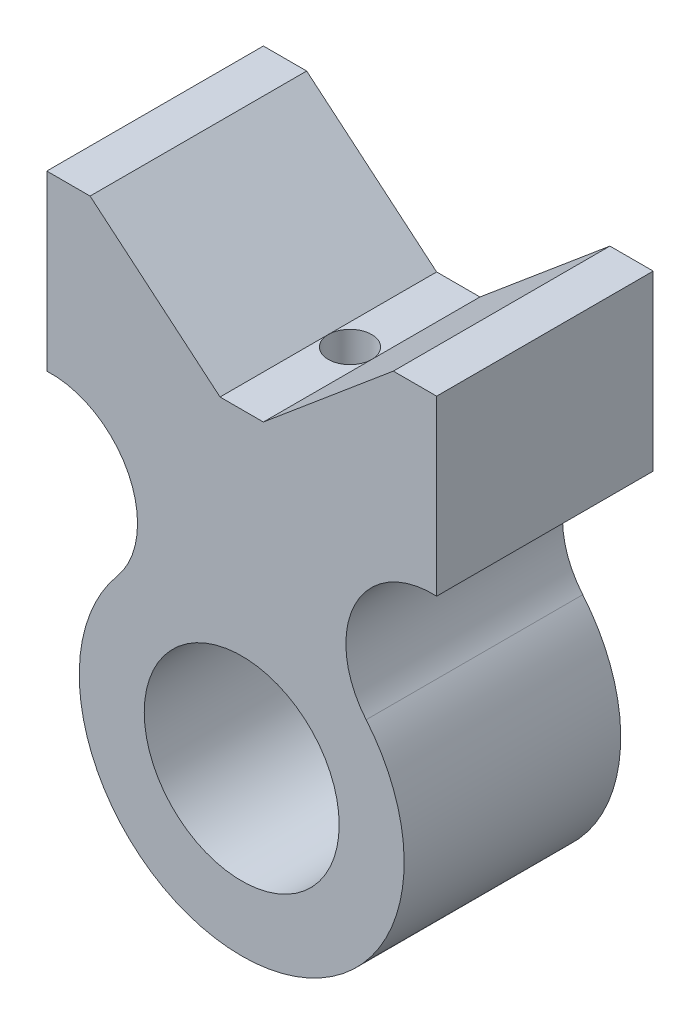
ISO-10303-21;
HEADER;
FILE_DESCRIPTION(('STEP AP214'),'2;1');
FILE_NAME('part.step','',(''),(''),'','','');
FILE_SCHEMA(('AUTOMOTIVE_DESIGN { 1 0 10303 214 1 1 1 1 }'));
ENDSEC;
DATA;
#1=APPLICATION_CONTEXT('core data for automotive mechanical design processes');
#2=APPLICATION_PROTOCOL_DEFINITION('international standard','automotive_design',2000,#1);
#3=PRODUCT_CONTEXT('',#1,'mechanical');
#4=PRODUCT('Part','Part','',(#3));
#5=PRODUCT_RELATED_PRODUCT_CATEGORY('part','',(#4));
#6=PRODUCT_DEFINITION_FORMATION('','',#4);
#7=PRODUCT_DEFINITION_CONTEXT('part definition',#1,'design');
#8=PRODUCT_DEFINITION('design','',#6,#7);
#9=PRODUCT_DEFINITION_SHAPE('','',#8);
#10=(LENGTH_UNIT() NAMED_UNIT(*) SI_UNIT(.MILLI.,.METRE.));
#11=(NAMED_UNIT(*) PLANE_ANGLE_UNIT() SI_UNIT($,.RADIAN.));
#12=(NAMED_UNIT(*) SI_UNIT($,.STERADIAN.) SOLID_ANGLE_UNIT());
#13=UNCERTAINTY_MEASURE_WITH_UNIT(LENGTH_MEASURE(1.E-05),#10,'distance_accuracy_value','');
#14=(GEOMETRIC_REPRESENTATION_CONTEXT(3) GLOBAL_UNCERTAINTY_ASSIGNED_CONTEXT((#13)) GLOBAL_UNIT_ASSIGNED_CONTEXT((#10,
#11,#12)) REPRESENTATION_CONTEXT('',''));
#15=CARTESIAN_POINT('',(0.,0.,0.));
#16=DIRECTION('',(0.,0.,1.));
#17=DIRECTION('',(1.,0.,0.));
#18=AXIS2_PLACEMENT_3D('',#15,#16,#17);
#19=CARTESIAN_POINT('',(5.,71.7646069847752,50.));
#20=DIRECTION('',(0.,-1.,0.));
#21=DIRECTION('',(1.,0.,0.));
#22=AXIS2_PLACEMENT_3D('',#19,#20,#21);
#23=PLANE('',#22);
#24=DIRECTION('',(0.,0.,-1.));
#25=VECTOR('',#24,1.);
#26=CARTESIAN_POINT('',(5.,71.7646069847752,50.));
#27=LINE('',#26,#25);
#28=CARTESIAN_POINT('',(5.,71.7646069847752,50.));
#29=VERTEX_POINT('',#28);
#30=CARTESIAN_POINT('',(5.,71.7646069847752,25.));
#31=VERTEX_POINT('',#30);
#32=EDGE_CURVE('E186',#29,#31,#27,.T.);
#33=ORIENTED_EDGE('',*,*,#32,.T.);
#34=CARTESIAN_POINT('',(4.97966993922955E-13,71.7646069847752,25.));
#35=DIRECTION('',(0.,1.,0.));
#36=DIRECTION('',(-1.,0.,0.));
#37=AXIS2_PLACEMENT_3D('',#34,#35,#36);
#38=CIRCLE('',#37,5.0000000000005);
#39=CARTESIAN_POINT('',(-5.,71.7646069847753,25.));
#40=VERTEX_POINT('',#39);
#41=EDGE_CURVE('E47',#40,#31,#38,.T.);
#42=ORIENTED_EDGE('',*,*,#41,.F.);
#43=DIRECTION('',(0.,0.,-1.));
#44=VECTOR('',#43,1.);
#45=CARTESIAN_POINT('',(-5.,71.7646069847753,50.));
#46=LINE('',#45,#44);
#47=CARTESIAN_POINT('',(-5.,71.7646069847753,50.));
#48=VERTEX_POINT('',#47);
#49=EDGE_CURVE('E182',#48,#40,#46,.T.);
#50=ORIENTED_EDGE('',*,*,#49,.F.);
#51=DIRECTION('',(-1.,0.,0.));
#52=VECTOR('',#51,1.);
#53=CARTESIAN_POINT('',(5.,71.7646069847752,50.));
#54=LINE('',#53,#52);
#55=EDGE_CURVE('E212',#29,#48,#54,.T.);
#56=ORIENTED_EDGE('',*,*,#55,.F.);
#57=EDGE_LOOP('',(#33,#42,#50,#56));
#58=FACE_BOUND('',#57,.T.);
#59=ADVANCED_FACE('F33',(#58),#23,.F.);
#60=CARTESIAN_POINT('',(44.0475554793416,36.9602875569761,50.));
#61=DIRECTION('',(0.,0.,-1.));
#62=DIRECTION('',(-1.,0.,0.));
#63=AXIS2_PLACEMENT_3D('',#60,#61,#62);
#64=PLANE('',#63);
#65=CARTESIAN_POINT('',(44.0475554793416,36.9602875569761,50.));
#66=DIRECTION('',(0.,0.,-1.));
#67=DIRECTION('',(-1.,0.,0.));
#68=AXIS2_PLACEMENT_3D('',#65,#66,#67);
#69=CIRCLE('',#68,20.0000000000003);
#70=CARTESIAN_POINT('',(28.7266666169617,24.1045353632452,50.));
#71=VERTEX_POINT('',#70);
#72=CARTESIAN_POINT('',(45.,56.9375959200936,50.));
#73=VERTEX_POINT('',#72);
#74=EDGE_CURVE('E174',#71,#73,#69,.T.);
#75=ORIENTED_EDGE('',*,*,#74,.T.);
#76=DIRECTION('',(0.,1.,0.));
#77=VECTOR('',#76,1.);
#78=CARTESIAN_POINT('',(45.,56.9375959200936,50.));
#79=LINE('',#78,#77);
#80=CARTESIAN_POINT('',(45.,96.9375959200936,50.));
#81=VERTEX_POINT('',#80);
#82=EDGE_CURVE('E103',#73,#81,#79,.T.);
#83=ORIENTED_EDGE('',*,*,#82,.T.);
#84=DIRECTION('',(-1.,0.,0.));
#85=VECTOR('',#84,1.);
#86=CARTESIAN_POINT('',(35.,96.9375959200936,50.));
#87=LINE('',#86,#85);
#88=CARTESIAN_POINT('',(35.,96.9375959200936,50.));
#89=VERTEX_POINT('',#88);
#90=EDGE_CURVE('E197',#81,#89,#87,.T.);
#91=ORIENTED_EDGE('',*,*,#90,.T.);
#92=DIRECTION('',(-0.766044443118978,-0.642787609686539,0.));
#93=VECTOR('',#92,1.);
#94=CARTESIAN_POINT('',(35.,96.9375959200936,50.));
#95=LINE('',#94,#93);
#96=EDGE_CURVE('E210',#89,#29,#95,.T.);
#97=ORIENTED_EDGE('',*,*,#96,.T.);
#98=ORIENTED_EDGE('',*,*,#55,.T.);
#99=DIRECTION('',(-0.766044443118979,0.642787609686538,0.));
#100=VECTOR('',#99,1.);
#101=CARTESIAN_POINT('',(-35.,96.9375959200936,50.));
#102=LINE('',#101,#100);
#103=CARTESIAN_POINT('',(-35.,96.9375959200936,50.));
#104=VERTEX_POINT('',#103);
#105=EDGE_CURVE('E214',#48,#104,#102,.T.);
#106=ORIENTED_EDGE('',*,*,#105,.T.);
#107=DIRECTION('',(-1.,0.,0.));
#108=VECTOR('',#107,1.);
#109=CARTESIAN_POINT('',(-35.,96.9375959200936,50.));
#110=LINE('',#109,#108);
#111=CARTESIAN_POINT('',(-45.,96.9375959200936,50.));
#112=VERTEX_POINT('',#111);
#113=EDGE_CURVE('E131',#104,#112,#110,.T.);
#114=ORIENTED_EDGE('',*,*,#113,.T.);
#115=DIRECTION('',(0.,-1.,0.));
#116=VECTOR('',#115,1.);
#117=CARTESIAN_POINT('',(-45.,56.9375959200936,50.));
#118=LINE('',#117,#116);
#119=CARTESIAN_POINT('',(-45.,56.9375959200936,50.));
#120=VERTEX_POINT('',#119);
#121=EDGE_CURVE('E123',#112,#120,#118,.T.);
#122=ORIENTED_EDGE('',*,*,#121,.T.);
#123=CARTESIAN_POINT('',(-44.0475554793416,36.9602875569761,50.));
#124=DIRECTION('',(0.,0.,-1.));
#125=DIRECTION('',(1.,0.,0.));
#126=AXIS2_PLACEMENT_3D('',#123,#124,#125);
#127=CIRCLE('',#126,20.0000000000003);
#128=CARTESIAN_POINT('',(-28.7266666169617,24.1045353632452,50.));
#129=VERTEX_POINT('',#128);
#130=EDGE_CURVE('E128',#120,#129,#127,.T.);
#131=ORIENTED_EDGE('',*,*,#130,.T.);
#132=CARTESIAN_POINT('',(0.,0.,50.));
#133=DIRECTION('',(0.,0.,1.));
#134=DIRECTION('',(1.,0.,0.));
#135=AXIS2_PLACEMENT_3D('',#132,#133,#134);
#136=CIRCLE('',#135,37.5);
#137=EDGE_CURVE('E56',#129,#71,#136,.T.);
#138=ORIENTED_EDGE('',*,*,#137,.T.);
#139=EDGE_LOOP('',(#75,#83,#91,#97,#98,#106,#114,#122,#131,#138));
#140=FACE_BOUND('',#139,.T.);
#141=CARTESIAN_POINT('',(0.,0.,50.));
#142=DIRECTION('',(0.,0.,1.));
#143=DIRECTION('',(1.,0.,0.));
#144=AXIS2_PLACEMENT_3D('',#141,#142,#143);
#145=CIRCLE('',#144,22.5);
#146=CARTESIAN_POINT('',(22.5,0.,50.));
#147=VERTEX_POINT('',#146);
#148=EDGE_CURVE('E156',#147,#147,#145,.T.);
#149=ORIENTED_EDGE('',*,*,#148,.F.);
#150=EDGE_LOOP('',(#149));
#151=FACE_BOUND('',#150,.T.);
#152=ADVANCED_FACE('F125',(#140,#151),#64,.F.);
#153=CARTESIAN_POINT('',(44.0475554793416,36.9602875569761,0.));
#154=DIRECTION('',(0.,0.,-1.));
#155=DIRECTION('',(-1.,0.,0.));
#156=AXIS2_PLACEMENT_3D('',#153,#154,#155);
#157=PLANE('',#156);
#158=CARTESIAN_POINT('',(44.0475554793416,36.9602875569761,0.));
#159=DIRECTION('',(0.,0.,-1.));
#160=DIRECTION('',(-1.,0.,0.));
#161=AXIS2_PLACEMENT_3D('',#158,#159,#160);
#162=CIRCLE('',#161,20.0000000000003);
#163=CARTESIAN_POINT('',(28.7266666169617,24.1045353632452,0.));
#164=VERTEX_POINT('',#163);
#165=CARTESIAN_POINT('',(45.,56.9375959200936,0.));
#166=VERTEX_POINT('',#165);
#167=EDGE_CURVE('E152',#164,#166,#162,.T.);
#168=ORIENTED_EDGE('',*,*,#167,.F.);
#169=CARTESIAN_POINT('',(0.,0.,0.));
#170=DIRECTION('',(0.,0.,1.));
#171=DIRECTION('',(1.,0.,0.));
#172=AXIS2_PLACEMENT_3D('',#169,#170,#171);
#173=CIRCLE('',#172,37.5);
#174=CARTESIAN_POINT('',(-28.7266666169617,24.1045353632452,0.));
#175=VERTEX_POINT('',#174);
#176=EDGE_CURVE('E95',#175,#164,#173,.T.);
#177=ORIENTED_EDGE('',*,*,#176,.F.);
#178=CARTESIAN_POINT('',(-44.0475554793416,36.9602875569761,0.));
#179=DIRECTION('',(0.,0.,-1.));
#180=DIRECTION('',(1.,0.,0.));
#181=AXIS2_PLACEMENT_3D('',#178,#179,#180);
#182=CIRCLE('',#181,20.0000000000003);
#183=CARTESIAN_POINT('',(-45.,56.9375959200936,0.));
#184=VERTEX_POINT('',#183);
#185=EDGE_CURVE('E171',#184,#175,#182,.T.);
#186=ORIENTED_EDGE('',*,*,#185,.F.);
#187=DIRECTION('',(0.,-1.,0.));
#188=VECTOR('',#187,1.);
#189=CARTESIAN_POINT('',(-45.,56.9375959200936,0.));
#190=LINE('',#189,#188);
#191=CARTESIAN_POINT('',(-45.,96.9375959200936,0.));
#192=VERTEX_POINT('',#191);
#193=EDGE_CURVE('E140',#192,#184,#190,.T.);
#194=ORIENTED_EDGE('',*,*,#193,.F.);
#195=DIRECTION('',(-1.,0.,0.));
#196=VECTOR('',#195,1.);
#197=CARTESIAN_POINT('',(-35.,96.9375959200936,0.));
#198=LINE('',#197,#196);
#199=CARTESIAN_POINT('',(-35.,96.9375959200936,0.));
#200=VERTEX_POINT('',#199);
#201=EDGE_CURVE('E168',#200,#192,#198,.T.);
#202=ORIENTED_EDGE('',*,*,#201,.F.);
#203=DIRECTION('',(-0.766044443118979,0.642787609686538,0.));
#204=VECTOR('',#203,1.);
#205=CARTESIAN_POINT('',(-35.,96.9375959200936,0.));
#206=LINE('',#205,#204);
#207=CARTESIAN_POINT('',(-5.,71.7646069847753,0.));
#208=VERTEX_POINT('',#207);
#209=EDGE_CURVE('E166',#208,#200,#206,.T.);
#210=ORIENTED_EDGE('',*,*,#209,.F.);
#211=DIRECTION('',(-1.,0.,0.));
#212=VECTOR('',#211,1.);
#213=CARTESIAN_POINT('',(5.,71.7646069847752,0.));
#214=LINE('',#213,#212);
#215=CARTESIAN_POINT('',(5.,71.7646069847752,0.));
#216=VERTEX_POINT('',#215);
#217=EDGE_CURVE('E163',#216,#208,#214,.T.);
#218=ORIENTED_EDGE('',*,*,#217,.F.);
#219=DIRECTION('',(-0.766044443118978,-0.642787609686539,0.));
#220=VECTOR('',#219,1.);
#221=CARTESIAN_POINT('',(35.,96.9375959200936,0.));
#222=LINE('',#221,#220);
#223=CARTESIAN_POINT('',(35.,96.9375959200936,0.));
#224=VERTEX_POINT('',#223);
#225=EDGE_CURVE('E160',#224,#216,#222,.T.);
#226=ORIENTED_EDGE('',*,*,#225,.F.);
#227=DIRECTION('',(-1.,0.,0.));
#228=VECTOR('',#227,1.);
#229=CARTESIAN_POINT('',(35.,96.9375959200936,0.));
#230=LINE('',#229,#228);
#231=CARTESIAN_POINT('',(45.,96.9375959200936,0.));
#232=VERTEX_POINT('',#231);
#233=EDGE_CURVE('E158',#232,#224,#230,.T.);
#234=ORIENTED_EDGE('',*,*,#233,.F.);
#235=DIRECTION('',(0.,1.,0.));
#236=VECTOR('',#235,1.);
#237=CARTESIAN_POINT('',(45.,56.9375959200936,0.));
#238=LINE('',#237,#236);
#239=EDGE_CURVE('E155',#166,#232,#238,.T.);
#240=ORIENTED_EDGE('',*,*,#239,.F.);
#241=EDGE_LOOP('',(#168,#177,#186,#194,#202,#210,#218,#226,#234,#240));
#242=FACE_BOUND('',#241,.T.);
#243=CARTESIAN_POINT('',(0.,0.,0.));
#244=DIRECTION('',(0.,0.,1.));
#245=DIRECTION('',(1.,0.,0.));
#246=AXIS2_PLACEMENT_3D('',#243,#244,#245);
#247=CIRCLE('',#246,22.5);
#248=CARTESIAN_POINT('',(22.5,0.,0.));
#249=VERTEX_POINT('',#248);
#250=EDGE_CURVE('E233',#249,#249,#247,.T.);
#251=ORIENTED_EDGE('',*,*,#250,.T.);
#252=EDGE_LOOP('',(#251));
#253=FACE_BOUND('',#252,.T.);
#254=ADVANCED_FACE('F201',(#242,#253),#157,.T.);
#255=CARTESIAN_POINT('',(44.0475554793416,36.9602875569761,50.));
#256=DIRECTION('',(0.,0.,-1.));
#257=DIRECTION('',(-1.,0.,0.));
#258=AXIS2_PLACEMENT_3D('',#255,#256,#257);
#259=CYLINDRICAL_SURFACE('',#258,20.0000000000003);
#260=ORIENTED_EDGE('',*,*,#167,.T.);
#261=DIRECTION('',(0.,0.,-1.));
#262=VECTOR('',#261,1.);
#263=CARTESIAN_POINT('',(45.,56.9375959200936,50.));
#264=LINE('',#263,#262);
#265=EDGE_CURVE('E11',#73,#166,#264,.T.);
#266=ORIENTED_EDGE('',*,*,#265,.F.);
#267=ORIENTED_EDGE('',*,*,#74,.F.);
#268=DIRECTION('',(0.,0.,-1.));
#269=VECTOR('',#268,1.);
#270=CARTESIAN_POINT('',(28.7266666169617,24.1045353632452,50.));
#271=LINE('',#270,#269);
#272=EDGE_CURVE('E148',#71,#164,#271,.T.);
#273=ORIENTED_EDGE('',*,*,#272,.T.);
#274=EDGE_LOOP('',(#260,#266,#267,#273));
#275=FACE_BOUND('',#274,.T.);
#276=ADVANCED_FACE('F35',(#275),#259,.F.);
#277=CARTESIAN_POINT('',(45.,56.9375959200936,50.));
#278=DIRECTION('',(-1.,0.,0.));
#279=DIRECTION('',(0.,0.,1.));
#280=AXIS2_PLACEMENT_3D('',#277,#278,#279);
#281=PLANE('',#280);
#282=ORIENTED_EDGE('',*,*,#239,.T.);
#283=DIRECTION('',(0.,0.,-1.));
#284=VECTOR('',#283,1.);
#285=CARTESIAN_POINT('',(45.,96.9375959200936,50.));
#286=LINE('',#285,#284);
#287=EDGE_CURVE('E41',#81,#232,#286,.T.);
#288=ORIENTED_EDGE('',*,*,#287,.F.);
#289=ORIENTED_EDGE('',*,*,#82,.F.);
#290=ORIENTED_EDGE('',*,*,#265,.T.);
#291=EDGE_LOOP('',(#282,#288,#289,#290));
#292=FACE_BOUND('',#291,.T.);
#293=ADVANCED_FACE('F278',(#292),#281,.F.);
#294=CARTESIAN_POINT('',(35.,96.9375959200936,50.));
#295=DIRECTION('',(0.,-1.,0.));
#296=DIRECTION('',(0.,0.,-1.));
#297=AXIS2_PLACEMENT_3D('',#294,#295,#296);
#298=PLANE('',#297);
#299=ORIENTED_EDGE('',*,*,#233,.T.);
#300=DIRECTION('',(0.,0.,-1.));
#301=VECTOR('',#300,1.);
#302=CARTESIAN_POINT('',(35.,96.9375959200936,50.));
#303=LINE('',#302,#301);
#304=EDGE_CURVE('E189',#89,#224,#303,.T.);
#305=ORIENTED_EDGE('',*,*,#304,.F.);
#306=ORIENTED_EDGE('',*,*,#90,.F.);
#307=ORIENTED_EDGE('',*,*,#287,.T.);
#308=EDGE_LOOP('',(#299,#305,#306,#307));
#309=FACE_BOUND('',#308,.T.);
#310=ADVANCED_FACE('F195',(#309),#298,.F.);
#311=CARTESIAN_POINT('',(35.,96.9375959200936,50.));
#312=DIRECTION('',(0.642787609686539,-0.766044443118978,0.));
#313=DIRECTION('',(0.766044443118979,0.642787609686539,0.));
#314=AXIS2_PLACEMENT_3D('',#311,#312,#313);
#315=PLANE('',#314);
#316=ORIENTED_EDGE('',*,*,#225,.T.);
#317=EDGE_CURVE('E185',#31,#216,#27,.T.);
#318=ORIENTED_EDGE('',*,*,#317,.F.);
#319=ORIENTED_EDGE('',*,*,#32,.F.);
#320=ORIENTED_EDGE('',*,*,#96,.F.);
#321=ORIENTED_EDGE('',*,*,#304,.T.);
#322=EDGE_LOOP('',(#316,#318,#319,#320,#321));
#323=FACE_BOUND('',#322,.T.);
#324=ADVANCED_FACE('F207',(#323),#315,.F.);
#325=EDGE_CURVE('E181',#40,#208,#46,.T.);
#326=ORIENTED_EDGE('',*,*,#325,.F.);
#327=EDGE_CURVE('E246',#31,#40,#38,.T.);
#328=ORIENTED_EDGE('',*,*,#327,.F.);
#329=ORIENTED_EDGE('',*,*,#317,.T.);
#330=ORIENTED_EDGE('',*,*,#217,.T.);
#331=EDGE_LOOP('',(#326,#328,#329,#330));
#332=FACE_BOUND('',#331,.T.);
#333=ADVANCED_FACE('F271',(#332),#23,.F.);
#334=CARTESIAN_POINT('',(-35.,96.9375959200936,50.));
#335=DIRECTION('',(-0.642787609686538,-0.766044443118979,0.));
#336=DIRECTION('',(0.766044443118979,-0.642787609686538,0.));
#337=AXIS2_PLACEMENT_3D('',#334,#335,#336);
#338=PLANE('',#337);
#339=ORIENTED_EDGE('',*,*,#209,.T.);
#340=DIRECTION('',(0.,0.,-1.));
#341=VECTOR('',#340,1.);
#342=CARTESIAN_POINT('',(-35.,96.9375959200936,50.));
#343=LINE('',#342,#341);
#344=EDGE_CURVE('E178',#104,#200,#343,.T.);
#345=ORIENTED_EDGE('',*,*,#344,.F.);
#346=ORIENTED_EDGE('',*,*,#105,.F.);
#347=ORIENTED_EDGE('',*,*,#49,.T.);
#348=ORIENTED_EDGE('',*,*,#325,.T.);
#349=EDGE_LOOP('',(#339,#345,#346,#347,#348));
#350=FACE_BOUND('',#349,.T.);
#351=ADVANCED_FACE('F223',(#350),#338,.F.);
#352=CARTESIAN_POINT('',(-35.,96.9375959200936,50.));
#353=DIRECTION('',(0.,-1.,0.));
#354=DIRECTION('',(0.,0.,-1.));
#355=AXIS2_PLACEMENT_3D('',#352,#353,#354);
#356=PLANE('',#355);
#357=ORIENTED_EDGE('',*,*,#201,.T.);
#358=DIRECTION('',(0.,0.,-1.));
#359=VECTOR('',#358,1.);
#360=CARTESIAN_POINT('',(-45.,96.9375959200936,50.));
#361=LINE('',#360,#359);
#362=EDGE_CURVE('E143',#112,#192,#361,.T.);
#363=ORIENTED_EDGE('',*,*,#362,.F.);
#364=ORIENTED_EDGE('',*,*,#113,.F.);
#365=ORIENTED_EDGE('',*,*,#344,.T.);
#366=EDGE_LOOP('',(#357,#363,#364,#365));
#367=FACE_BOUND('',#366,.T.);
#368=ADVANCED_FACE('F226',(#367),#356,.F.);
#369=CARTESIAN_POINT('',(-45.,56.9375959200936,50.));
#370=DIRECTION('',(1.,0.,0.));
#371=DIRECTION('',(0.,0.,-1.));
#372=AXIS2_PLACEMENT_3D('',#369,#370,#371);
#373=PLANE('',#372);
#374=ORIENTED_EDGE('',*,*,#193,.T.);
#375=DIRECTION('',(0.,0.,-1.));
#376=VECTOR('',#375,1.);
#377=CARTESIAN_POINT('',(-45.,56.9375959200936,50.));
#378=LINE('',#377,#376);
#379=EDGE_CURVE('E137',#120,#184,#378,.T.);
#380=ORIENTED_EDGE('',*,*,#379,.F.);
#381=ORIENTED_EDGE('',*,*,#121,.F.);
#382=ORIENTED_EDGE('',*,*,#362,.T.);
#383=EDGE_LOOP('',(#374,#380,#381,#382));
#384=FACE_BOUND('',#383,.T.);
#385=ADVANCED_FACE('F138',(#384),#373,.F.);
#386=CARTESIAN_POINT('',(-44.0475554793416,36.9602875569761,50.));
#387=DIRECTION('',(0.,0.,-1.));
#388=DIRECTION('',(-1.,0.,0.));
#389=AXIS2_PLACEMENT_3D('',#386,#387,#388);
#390=CYLINDRICAL_SURFACE('',#389,20.0000000000003);
#391=ORIENTED_EDGE('',*,*,#185,.T.);
#392=DIRECTION('',(0.,0.,-1.));
#393=VECTOR('',#392,1.);
#394=CARTESIAN_POINT('',(-28.7266666169617,24.1045353632452,50.));
#395=LINE('',#394,#393);
#396=EDGE_CURVE('E144',#129,#175,#395,.T.);
#397=ORIENTED_EDGE('',*,*,#396,.F.);
#398=ORIENTED_EDGE('',*,*,#130,.F.);
#399=ORIENTED_EDGE('',*,*,#379,.T.);
#400=EDGE_LOOP('',(#391,#397,#398,#399));
#401=FACE_BOUND('',#400,.T.);
#402=ADVANCED_FACE('F146',(#401),#390,.F.);
#403=CARTESIAN_POINT('',(0.,0.,50.));
#404=DIRECTION('',(0.,0.,-1.));
#405=DIRECTION('',(-1.,0.,0.));
#406=AXIS2_PLACEMENT_3D('',#403,#404,#405);
#407=CYLINDRICAL_SURFACE('',#406,37.5);
#408=ORIENTED_EDGE('',*,*,#176,.T.);
#409=ORIENTED_EDGE('',*,*,#272,.F.);
#410=ORIENTED_EDGE('',*,*,#137,.F.);
#411=ORIENTED_EDGE('',*,*,#396,.T.);
#412=EDGE_LOOP('',(#408,#409,#410,#411));
#413=FACE_BOUND('',#412,.T.);
#414=ADVANCED_FACE('F227',(#413),#407,.T.);
#415=CARTESIAN_POINT('',(0.,0.,50.));
#416=DIRECTION('',(0.,0.,-1.));
#417=DIRECTION('',(-1.,0.,0.));
#418=AXIS2_PLACEMENT_3D('',#415,#416,#417);
#419=CYLINDRICAL_SURFACE('',#418,22.5);
#420=CARTESIAN_POINT('',(-5.00000000000035,21.9374109684802,25.));
#421=CARTESIAN_POINT('',(-4.99999062369905,21.9374165661432,25.27710591929));
#422=CARTESIAN_POINT('',(-4.97688532864198,21.9427186339959,25.5543235316462));
#423=CARTESIAN_POINT('',(-4.88518059165747,21.9633134762852,26.1008670652223));
#424=CARTESIAN_POINT('',(-4.81654894253596,21.9786133234432,26.3701872585401));
#425=CARTESIAN_POINT('',(-4.6360659578073,22.017387309419,26.8929510556743));
#426=CARTESIAN_POINT('',(-4.52426292001554,22.0408523106148,27.1464120350012));
#427=CARTESIAN_POINT('',(-4.26075008588305,22.0933016577054,27.6309875176431));
#428=CARTESIAN_POINT('',(-4.10904084039557,22.1222859274125,27.8621023293576));
#429=CARTESIAN_POINT('',(-3.76720268647831,22.1830725820844,28.2994564284213));
#430=CARTESIAN_POINT('',(-3.5765092444807,22.2149119956475,28.5052494052997));
#431=CARTESIAN_POINT('',(-3.16333419715929,22.2774975861789,28.882206881098));
#432=CARTESIAN_POINT('',(-2.94085007353809,22.3082436762984,29.0533686341095));
#433=CARTESIAN_POINT('',(-2.46740986309402,22.3655823200431,29.3579768784887));
#434=CARTESIAN_POINT('',(-2.21617054133277,22.3921260851858,29.4909931236333));
#435=CARTESIAN_POINT('',(-1.69421583912989,22.4376506083871,29.7127495043017));
#436=CARTESIAN_POINT('',(-1.42350272001738,22.4566322429044,29.801494771178));
#437=CARTESIAN_POINT('',(-0.874926990820781,22.4846321116813,29.9307835823476));
#438=CARTESIAN_POINT('',(-0.597250570654721,22.4938063731733,29.9720827730015));
#439=CARTESIAN_POINT('',(-0.038769144464916,22.501698723801,30.0076706771816));
#440=CARTESIAN_POINT('',(0.242035488691535,22.5004180460737,30.001964934835));
#441=CARTESIAN_POINT('',(0.793589802336086,22.4876637337819,29.9442656937604));
#442=CARTESIAN_POINT('',(1.06442946081812,22.4763694901164,29.8930868022728));
#443=CARTESIAN_POINT('',(1.59357711385885,22.4450619325581,29.7471933311125));
#444=CARTESIAN_POINT('',(1.85188452935739,22.4250482162021,29.6524767418672));
#445=CARTESIAN_POINT('',(2.35088442347765,22.3782634651396,29.4214825647482));
#446=CARTESIAN_POINT('',(2.59143005223527,22.3514428138133,29.2848982086397));
#447=CARTESIAN_POINT('',(3.04648284136263,22.2939817921069,28.9742747651275));
#448=CARTESIAN_POINT('',(3.26098634157496,22.2633408860233,28.800230422324));
#449=CARTESIAN_POINT('',(3.6627124739519,22.2008291431457,28.4151995153695));
#450=CARTESIAN_POINT('',(3.84925054618852,22.1689460239095,28.2035000600789));
#451=CARTESIAN_POINT('',(4.18430757551675,22.1081580361396,27.751493130952));
#452=CARTESIAN_POINT('',(4.33282543373037,22.0792532537016,27.5111848305435));
#453=CARTESIAN_POINT('',(4.58794414789291,22.0276608387749,27.0076502791447));
#454=CARTESIAN_POINT('',(4.69441193598753,22.0049930107584,26.744354443057));
#455=CARTESIAN_POINT('',(4.86138173804804,21.9687128511932,26.2029845718652));
#456=CARTESIAN_POINT('',(4.92189130425445,21.9550990318596,25.9249129728775));
#457=CARTESIAN_POINT('',(4.99415747251417,21.9387727122217,25.3681500323262));
#458=CARTESIAN_POINT('',(5.0069124691967,21.9358370046808,25.0895946723793));
#459=CARTESIAN_POINT('',(4.98601368560657,21.9405966113851,24.5343376925861));
#460=CARTESIAN_POINT('',(4.95236320469083,21.9482911698351,24.2576359423565));
#461=CARTESIAN_POINT('',(4.84047593306943,21.9732332073389,23.7174411562658));
#462=CARTESIAN_POINT('',(4.76279231636185,21.9903620918492,23.4538275617611));
#463=CARTESIAN_POINT('',(4.56564437846834,22.0321352125225,22.9433584221761));
#464=CARTESIAN_POINT('',(4.44617595275083,22.0567801869622,22.6965045262506));
#465=CARTESIAN_POINT('',(4.16666175416439,22.111296851325,22.2222509955592));
#466=CARTESIAN_POINT('',(4.0060028617717,22.1412451911084,21.9952217125372));
#467=CARTESIAN_POINT('',(3.64946760734483,22.2027935503205,21.5709791064778));
#468=CARTESIAN_POINT('',(3.45358672382786,22.2343937814342,21.3737696174282));
#469=CARTESIAN_POINT('',(3.02764303653704,22.2964233481836,21.0108716412282));
#470=CARTESIAN_POINT('',(2.79699352459116,22.3268183182884,20.845864910326));
#471=CARTESIAN_POINT('',(2.31067040535689,22.3823727860854,20.5569396644145));
#472=CARTESIAN_POINT('',(2.05499798703305,22.407532532352,20.433019198416));
#473=CARTESIAN_POINT('',(1.52750475000858,22.4496372179897,20.230724713416));
#474=CARTESIAN_POINT('',(1.25580097043633,22.4666350054648,20.1520570102641));
#475=CARTESIAN_POINT('',(0.702612716989238,22.4907294174878,20.0415870999582));
#476=CARTESIAN_POINT('',(0.421129719813202,22.4978275303209,20.0097778482149));
#477=CARTESIAN_POINT('',(-0.137162113850751,22.501276880007,19.9942530440771));
#478=CARTESIAN_POINT('',(-0.413941764340341,22.4978552807622,20.0095209233513));
#479=CARTESIAN_POINT('',(-0.960885103415277,22.481138161578,20.0854373763914));
#480=CARTESIAN_POINT('',(-1.23104891835815,22.4678428303717,20.1460850827371));
#481=CARTESIAN_POINT('',(-1.75627571196658,22.4328909266112,20.3105458929863));
#482=CARTESIAN_POINT('',(-2.01138720660136,22.4112631248155,20.4142105597513));
#483=CARTESIAN_POINT('',(-2.50072882023264,22.3619521829452,20.6616195088482));
#484=CARTESIAN_POINT('',(-2.73495683947683,22.3342684349331,20.8053678154501));
#485=CARTESIAN_POINT('',(-3.18082724877507,22.2751870653884,21.1321556936573));
#486=CARTESIAN_POINT('',(-3.3919393959825,22.2437274871573,21.3159075892232));
#487=CARTESIAN_POINT('',(-3.7806793308829,22.1809676794422,21.7160553411305));
#488=CARTESIAN_POINT('',(-3.95829899997885,22.1496674903786,21.9324590894749));
#489=CARTESIAN_POINT('',(-4.27739627854984,22.0902842541619,22.3953862494696));
#490=CARTESIAN_POINT('',(-4.41833714644963,22.0622519776712,22.6422865418514));
#491=CARTESIAN_POINT('',(-4.65650065811696,22.0132210046622,23.1568422384277));
#492=CARTESIAN_POINT('',(-4.75375976933279,21.9922164448482,23.4244801102639));
#493=CARTESIAN_POINT('',(-4.8847337366437,21.9634405435101,23.910266185138));
#494=CARTESIAN_POINT('',(-4.92787455119996,21.9537451128598,24.1258085681836));
#495=CARTESIAN_POINT('',(-4.98551065426556,21.9407282728786,24.5608773914504));
#496=CARTESIAN_POINT('',(-5.00000743037855,21.9374065325356,24.7804036241761));
#497=CARTESIAN_POINT('',(-5.00000000000035,21.9374109684802,25.));
#498=B_SPLINE_CURVE_WITH_KNOTS('',3,(#420,#421,#422,#423,#424,#425,#426,#427,#428,#429,#430,
#431,#432,#433,#434,#435,#436,#437,#438,#439,#440,#441,#442,#443,#444,#445,#446,#447,#448,#449,
#450,#451,#452,#453,#454,#455,#456,#457,#458,#459,#460,#461,#462,#463,#464,#465,#466,#467,#468,
#469,#470,#471,#472,#473,#474,#475,#476,#477,#478,#479,#480,#481,#482,#483,#484,#485,#486,#487,
#488,#489,#490,#491,#492,#493,#494,#495,#496,#497),.UNSPECIFIED.,.T.,.F.,(4,2,2,2,2,2,2,2,2,2,2,
2,2,2,2,2,2,2,2,2,2,2,2,2,2,2,2,2,2,2,2,2,2,2,2,2,2,2,4),(0.,0.830512792551711,1.6616137511149,
2.49178760019477,3.32194999040652,4.16511484799147,5.00834653390803,5.86074531607079,
6.71304527558233,7.55157428697548,8.39000439715287,9.21371104602372,10.0374557186017,
10.8673864501634,11.6974336917533,12.5453011824508,13.3931931758447,14.2437472362763,
15.0941614962715,15.9266937379848,16.7591667910086,17.5814064488676,18.4037268982158,
19.2390807182779,20.0745418502148,20.9261261511889,21.777670008722,22.6236232364916,
23.4694492726609,24.2971396892324,25.124814285185,25.9496562945844,26.7745811453355,
27.6156117364709,28.4568459325933,29.3097742884878,30.1619892526943,30.8201746575845,
31.4783258792799),.UNSPECIFIED.);
#499=CARTESIAN_POINT('',(-5.00000000000035,21.9374109684802,25.));
#500=VERTEX_POINT('',#499);
#501=EDGE_CURVE('E238',#500,#500,#498,.T.);
#502=ORIENTED_EDGE('',*,*,#501,.T.);
#503=EDGE_LOOP('',(#502));
#504=FACE_BOUND('',#503,.T.);
#505=ORIENTED_EDGE('',*,*,#148,.T.);
#506=EDGE_LOOP('',(#505));
#507=FACE_BOUND('',#506,.T.);
#508=ORIENTED_EDGE('',*,*,#250,.F.);
#509=EDGE_LOOP('',(#508));
#510=FACE_BOUND('',#509,.T.);
#511=ADVANCED_FACE('F252',(#504,#507,#510),#419,.F.);
#512=CARTESIAN_POINT('',(-2.60215460290427E-13,-37.5010000000003,25.));
#513=DIRECTION('',(0.,1.,0.));
#514=DIRECTION('',(-1.,0.,0.));
#515=AXIS2_PLACEMENT_3D('',#512,#513,#514);
#516=CYLINDRICAL_SURFACE('',#515,5.0000000000005);
#517=ORIENTED_EDGE('',*,*,#501,.F.);
#518=EDGE_LOOP('',(#517));
#519=FACE_BOUND('',#518,.T.);
#520=ORIENTED_EDGE('',*,*,#41,.T.);
#521=ORIENTED_EDGE('',*,*,#327,.T.);
#522=EDGE_LOOP('',(#520,#521));
#523=FACE_BOUND('',#522,.T.);
#524=ADVANCED_FACE('F247',(#519,#523),#516,.F.);
#525=CLOSED_SHELL('',(#59,#152,#254,#276,#293,#310,#324,#333,#351,#368,#385,#402,#414,#511,#524));
#526=MANIFOLD_SOLID_BREP('B2',#525);
#527=ADVANCED_BREP_SHAPE_REPRESENTATION('',(#18,#526),#14);
#528=SHAPE_DEFINITION_REPRESENTATION(#9,#527);
ENDSEC;
END-ISO-10303-21;
